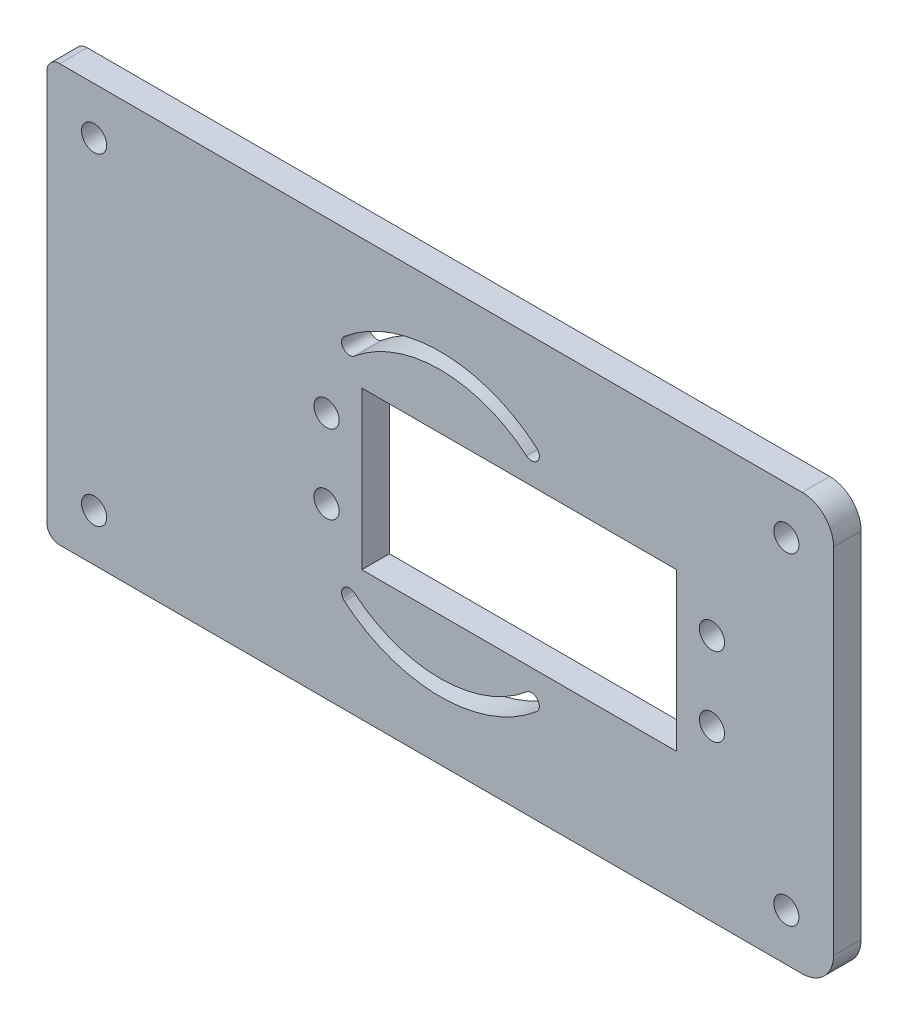
ISO-10303-21;
HEADER;
FILE_DESCRIPTION(('STEP AP214'),'2;1');
FILE_NAME('part.step','',(''),(''),'','','');
FILE_SCHEMA(('AUTOMOTIVE_DESIGN { 1 0 10303 214 1 1 1 1 }'));
ENDSEC;
DATA;
#1=APPLICATION_CONTEXT('core data for automotive mechanical design processes');
#2=APPLICATION_PROTOCOL_DEFINITION('international standard','automotive_design',2000,#1);
#3=PRODUCT_CONTEXT('',#1,'mechanical');
#4=PRODUCT('Part','Part','',(#3));
#5=PRODUCT_RELATED_PRODUCT_CATEGORY('part','',(#4));
#6=PRODUCT_DEFINITION_FORMATION('','',#4);
#7=PRODUCT_DEFINITION_CONTEXT('part definition',#1,'design');
#8=PRODUCT_DEFINITION('design','',#6,#7);
#9=PRODUCT_DEFINITION_SHAPE('','',#8);
#10=(LENGTH_UNIT() NAMED_UNIT(*) SI_UNIT(.MILLI.,.METRE.));
#11=(NAMED_UNIT(*) PLANE_ANGLE_UNIT() SI_UNIT($,.RADIAN.));
#12=(NAMED_UNIT(*) SI_UNIT($,.STERADIAN.) SOLID_ANGLE_UNIT());
#13=UNCERTAINTY_MEASURE_WITH_UNIT(LENGTH_MEASURE(1.E-05),#10,'distance_accuracy_value','');
#14=(GEOMETRIC_REPRESENTATION_CONTEXT(3) GLOBAL_UNCERTAINTY_ASSIGNED_CONTEXT((#13)) GLOBAL_UNIT_ASSIGNED_CONTEXT((#10,
#11,#12)) REPRESENTATION_CONTEXT('',''));
#15=CARTESIAN_POINT('',(0.,0.,0.));
#16=DIRECTION('',(0.,0.,1.));
#17=DIRECTION('',(1.,0.,0.));
#18=AXIS2_PLACEMENT_3D('',#15,#16,#17);
#19=CARTESIAN_POINT('',(-0.0442005485762831,0.,3.5));
#20=DIRECTION('',(0.,0.,-1.));
#21=DIRECTION('',(-1.,0.,0.));
#22=AXIS2_PLACEMENT_3D('',#19,#20,#21);
#23=CYLINDRICAL_SURFACE('',#22,19.);
#24=CARTESIAN_POINT('',(-0.0442005485762831,0.,0.));
#25=DIRECTION('',(0.,0.,1.));
#26=DIRECTION('',(1.,0.,0.));
#27=AXIS2_PLACEMENT_3D('',#24,#25,#26);
#28=CIRCLE('',#27,19.);
#29=CARTESIAN_POINT('',(-12.2297645811815,14.5777923296801,0.));
#30=VERTEX_POINT('',#29);
#31=CARTESIAN_POINT('',(12.1961213713889,14.5318450065922,0.));
#32=VERTEX_POINT('',#31);
#33=EDGE_CURVE('E274',#30,#32,#28,.F.);
#34=ORIENTED_EDGE('',*,*,#33,.T.);
#35=DIRECTION('',(0.,0.,-1.));
#36=VECTOR('',#35,1.);
#37=CARTESIAN_POINT('',(12.1961213713889,14.5318450065922,3.5));
#38=LINE('',#37,#36);
#39=CARTESIAN_POINT('',(12.1961213713889,14.5318450065922,3.5));
#40=VERTEX_POINT('',#39);
#41=EDGE_CURVE('E11',#40,#32,#38,.T.);
#42=ORIENTED_EDGE('',*,*,#41,.F.);
#43=CARTESIAN_POINT('',(-0.0442005485762831,0.,3.5));
#44=DIRECTION('',(0.,0.,1.));
#45=DIRECTION('',(1.,0.,0.));
#46=AXIS2_PLACEMENT_3D('',#43,#44,#45);
#47=CIRCLE('',#46,19.);
#48=CARTESIAN_POINT('',(-12.2297645811815,14.5777923296801,3.5));
#49=VERTEX_POINT('',#48);
#50=EDGE_CURVE('E185',#49,#40,#47,.F.);
#51=ORIENTED_EDGE('',*,*,#50,.F.);
#52=DIRECTION('',(0.,0.,-1.));
#53=VECTOR('',#52,1.);
#54=CARTESIAN_POINT('',(-12.2297645811815,14.5777923296801,3.5));
#55=LINE('',#54,#53);
#56=EDGE_CURVE('E288',#49,#30,#55,.T.);
#57=ORIENTED_EDGE('',*,*,#56,.T.);
#58=EDGE_LOOP('',(#34,#42,#51,#57));
#59=FACE_BOUND('',#58,.T.);
#60=ADVANCED_FACE('F35',(#59),#23,.F.);
#61=CARTESIAN_POINT('',(11.5518939019171,13.7670110588768,3.5));
#62=DIRECTION('',(0.,0.,-1.));
#63=DIRECTION('',(-1.,0.,0.));
#64=AXIS2_PLACEMENT_3D('',#61,#62,#63);
#65=CYLINDRICAL_SURFACE('',#64,1.00000000000001);
#66=CARTESIAN_POINT('',(11.5518939019171,13.7670110588768,0.));
#67=DIRECTION('',(0.,0.,1.));
#68=DIRECTION('',(1.,0.,0.));
#69=AXIS2_PLACEMENT_3D('',#66,#67,#68);
#70=CIRCLE('',#69,1.00000000000001);
#71=CARTESIAN_POINT('',(10.9076664324452,13.0021771111615,0.));
#72=VERTEX_POINT('',#71);
#73=EDGE_CURVE('E191',#32,#72,#70,.F.);
#74=ORIENTED_EDGE('',*,*,#73,.T.);
#75=DIRECTION('',(0.,0.,-1.));
#76=VECTOR('',#75,1.);
#77=CARTESIAN_POINT('',(10.9076664324452,13.0021771111615,3.5));
#78=LINE('',#77,#76);
#79=CARTESIAN_POINT('',(10.9076664324452,13.0021771111615,3.5));
#80=VERTEX_POINT('',#79);
#81=EDGE_CURVE('E45',#80,#72,#78,.T.);
#82=ORIENTED_EDGE('',*,*,#81,.F.);
#83=CARTESIAN_POINT('',(11.5518939019171,13.7670110588768,3.5));
#84=DIRECTION('',(0.,0.,1.));
#85=DIRECTION('',(1.,0.,0.));
#86=AXIS2_PLACEMENT_3D('',#83,#84,#85);
#87=CIRCLE('',#86,1.00000000000001);
#88=EDGE_CURVE('E178',#40,#80,#87,.F.);
#89=ORIENTED_EDGE('',*,*,#88,.F.);
#90=ORIENTED_EDGE('',*,*,#41,.T.);
#91=EDGE_LOOP('',(#74,#82,#89,#90));
#92=FACE_BOUND('',#91,.T.);
#93=ADVANCED_FACE('F190',(#92),#65,.F.);
#94=CARTESIAN_POINT('',(-0.0442005485762831,0.,3.5));
#95=DIRECTION('',(0.,0.,-1.));
#96=DIRECTION('',(-1.,0.,0.));
#97=AXIS2_PLACEMENT_3D('',#94,#95,#96);
#98=CYLINDRICAL_SURFACE('',#97,17.);
#99=CARTESIAN_POINT('',(-0.0442005485762831,0.,0.));
#100=DIRECTION('',(0.,0.,1.));
#101=DIRECTION('',(1.,0.,0.));
#102=AXIS2_PLACEMENT_3D('',#99,#100,#101);
#103=CIRCLE('',#102,17.);
#104=CARTESIAN_POINT('',(-10.9470736303809,13.0432878739243,0.));
#105=VERTEX_POINT('',#104);
#106=EDGE_CURVE('E278',#105,#72,#103,.F.);
#107=ORIENTED_EDGE('',*,*,#106,.F.);
#108=DIRECTION('',(0.,0.,-1.));
#109=VECTOR('',#108,1.);
#110=CARTESIAN_POINT('',(-10.9470736303809,13.0432878739243,3.5));
#111=LINE('',#110,#109);
#112=CARTESIAN_POINT('',(-10.9470736303809,13.0432878739243,3.5));
#113=VERTEX_POINT('',#112);
#114=EDGE_CURVE('E118',#113,#105,#111,.T.);
#115=ORIENTED_EDGE('',*,*,#114,.F.);
#116=CARTESIAN_POINT('',(-0.0442005485762831,0.,3.5));
#117=DIRECTION('',(0.,0.,1.));
#118=DIRECTION('',(1.,0.,0.));
#119=AXIS2_PLACEMENT_3D('',#116,#117,#118);
#120=CIRCLE('',#119,17.);
#121=EDGE_CURVE('E183',#113,#80,#120,.F.);
#122=ORIENTED_EDGE('',*,*,#121,.T.);
#123=ORIENTED_EDGE('',*,*,#81,.T.);
#124=EDGE_LOOP('',(#107,#115,#122,#123));
#125=FACE_BOUND('',#124,.T.);
#126=ADVANCED_FACE('F196',(#125),#98,.T.);
#127=CARTESIAN_POINT('',(0.,10.,3.5));
#128=DIRECTION('',(0.,1.,0.));
#129=DIRECTION('',(-1.,0.,0.));
#130=AXIS2_PLACEMENT_3D('',#127,#128,#129);
#131=PLANE('',#130);
#132=DIRECTION('',(1.,0.,0.));
#133=VECTOR('',#132,1.);
#134=CARTESIAN_POINT('',(0.,10.,0.));
#135=LINE('',#134,#133);
#136=CARTESIAN_POINT('',(-10.,10.,0.));
#137=VERTEX_POINT('',#136);
#138=CARTESIAN_POINT('',(30.,10.,0.));
#139=VERTEX_POINT('',#138);
#140=EDGE_CURVE('E262',#137,#139,#135,.T.);
#141=ORIENTED_EDGE('',*,*,#140,.T.);
#142=DIRECTION('',(0.,0.,-1.));
#143=VECTOR('',#142,1.);
#144=CARTESIAN_POINT('',(30.,10.,3.5));
#145=LINE('',#144,#143);
#146=CARTESIAN_POINT('',(30.,10.,3.5));
#147=VERTEX_POINT('',#146);
#148=EDGE_CURVE('E290',#147,#139,#145,.T.);
#149=ORIENTED_EDGE('',*,*,#148,.F.);
#150=DIRECTION('',(1.,0.,0.));
#151=VECTOR('',#150,1.);
#152=CARTESIAN_POINT('',(0.,10.,3.5));
#153=LINE('',#152,#151);
#154=CARTESIAN_POINT('',(-10.,10.,3.5));
#155=VERTEX_POINT('',#154);
#156=EDGE_CURVE('E384',#155,#147,#153,.T.);
#157=ORIENTED_EDGE('',*,*,#156,.F.);
#158=DIRECTION('',(0.,0.,-1.));
#159=VECTOR('',#158,1.);
#160=CARTESIAN_POINT('',(-10.,10.,3.5));
#161=LINE('',#160,#159);
#162=EDGE_CURVE('E292',#155,#137,#161,.T.);
#163=ORIENTED_EDGE('',*,*,#162,.T.);
#164=EDGE_LOOP('',(#141,#149,#157,#163));
#165=FACE_BOUND('',#164,.T.);
#166=ADVANCED_FACE('F410',(#165),#131,.F.);
#167=CARTESIAN_POINT('',(30.,0.,3.5));
#168=DIRECTION('',(1.,0.,0.));
#169=DIRECTION('',(0.,0.,-1.));
#170=AXIS2_PLACEMENT_3D('',#167,#168,#169);
#171=PLANE('',#170);
#172=DIRECTION('',(0.,-1.,0.));
#173=VECTOR('',#172,1.);
#174=CARTESIAN_POINT('',(30.,0.,0.));
#175=LINE('',#174,#173);
#176=CARTESIAN_POINT('',(30.,-10.,0.));
#177=VERTEX_POINT('',#176);
#178=EDGE_CURVE('E265',#139,#177,#175,.T.);
#179=ORIENTED_EDGE('',*,*,#178,.T.);
#180=DIRECTION('',(0.,0.,-1.));
#181=VECTOR('',#180,1.);
#182=CARTESIAN_POINT('',(30.,-10.,3.5));
#183=LINE('',#182,#181);
#184=CARTESIAN_POINT('',(30.,-10.,3.5));
#185=VERTEX_POINT('',#184);
#186=EDGE_CURVE('E297',#185,#177,#183,.T.);
#187=ORIENTED_EDGE('',*,*,#186,.F.);
#188=DIRECTION('',(0.,-1.,0.));
#189=VECTOR('',#188,1.);
#190=CARTESIAN_POINT('',(30.,0.,3.5));
#191=LINE('',#190,#189);
#192=EDGE_CURVE('E387',#147,#185,#191,.T.);
#193=ORIENTED_EDGE('',*,*,#192,.F.);
#194=ORIENTED_EDGE('',*,*,#148,.T.);
#195=EDGE_LOOP('',(#179,#187,#193,#194));
#196=FACE_BOUND('',#195,.T.);
#197=ADVANCED_FACE('F412',(#196),#171,.F.);
#198=CARTESIAN_POINT('',(0.,-10.,3.5));
#199=DIRECTION('',(0.,1.,0.));
#200=DIRECTION('',(-1.,0.,0.));
#201=AXIS2_PLACEMENT_3D('',#198,#199,#200);
#202=PLANE('',#201);
#203=DIRECTION('',(1.,0.,0.));
#204=VECTOR('',#203,1.);
#205=CARTESIAN_POINT('',(0.,-10.,0.));
#206=LINE('',#205,#204);
#207=CARTESIAN_POINT('',(-10.,-10.,0.));
#208=VERTEX_POINT('',#207);
#209=EDGE_CURVE('E268',#208,#177,#206,.T.);
#210=ORIENTED_EDGE('',*,*,#209,.F.);
#211=DIRECTION('',(0.,0.,-1.));
#212=VECTOR('',#211,1.);
#213=CARTESIAN_POINT('',(-10.,-10.,3.5));
#214=LINE('',#213,#212);
#215=CARTESIAN_POINT('',(-10.,-10.,3.5));
#216=VERTEX_POINT('',#215);
#217=EDGE_CURVE('E294',#216,#208,#214,.T.);
#218=ORIENTED_EDGE('',*,*,#217,.F.);
#219=DIRECTION('',(1.,0.,0.));
#220=VECTOR('',#219,1.);
#221=CARTESIAN_POINT('',(0.,-10.,3.5));
#222=LINE('',#221,#220);
#223=EDGE_CURVE('E389',#216,#185,#222,.T.);
#224=ORIENTED_EDGE('',*,*,#223,.T.);
#225=ORIENTED_EDGE('',*,*,#186,.T.);
#226=EDGE_LOOP('',(#210,#218,#224,#225));
#227=FACE_BOUND('',#226,.T.);
#228=ADVANCED_FACE('F405',(#227),#202,.T.);
#229=CARTESIAN_POINT('',(11.5518939019171,-13.7670110588768,3.5));
#230=DIRECTION('',(0.,0.,-1.));
#231=DIRECTION('',(-1.,0.,0.));
#232=AXIS2_PLACEMENT_3D('',#229,#230,#231);
#233=CYLINDRICAL_SURFACE('',#232,1.);
#234=CARTESIAN_POINT('',(11.5518939019171,-13.7670110588768,0.));
#235=DIRECTION('',(0.,0.,1.));
#236=DIRECTION('',(1.,0.,0.));
#237=AXIS2_PLACEMENT_3D('',#234,#235,#236);
#238=CIRCLE('',#237,1.);
#239=CARTESIAN_POINT('',(12.1961213713889,-14.5318450065922,0.));
#240=VERTEX_POINT('',#239);
#241=CARTESIAN_POINT('',(10.9076664324452,-13.0021771111615,0.));
#242=VERTEX_POINT('',#241);
#243=EDGE_CURVE('E238',#240,#242,#238,.T.);
#244=ORIENTED_EDGE('',*,*,#243,.F.);
#245=DIRECTION('',(0.,0.,-1.));
#246=VECTOR('',#245,1.);
#247=CARTESIAN_POINT('',(12.1961213713889,-14.5318450065922,3.5));
#248=LINE('',#247,#246);
#249=CARTESIAN_POINT('',(12.1961213713889,-14.5318450065922,3.5));
#250=VERTEX_POINT('',#249);
#251=EDGE_CURVE('E295',#250,#240,#248,.T.);
#252=ORIENTED_EDGE('',*,*,#251,.F.);
#253=CARTESIAN_POINT('',(11.5518939019171,-13.7670110588768,3.5));
#254=DIRECTION('',(0.,0.,1.));
#255=DIRECTION('',(1.,0.,0.));
#256=AXIS2_PLACEMENT_3D('',#253,#254,#255);
#257=CIRCLE('',#256,1.);
#258=CARTESIAN_POINT('',(10.9076664324452,-13.0021771111615,3.5));
#259=VERTEX_POINT('',#258);
#260=EDGE_CURVE('E361',#250,#259,#257,.T.);
#261=ORIENTED_EDGE('',*,*,#260,.T.);
#262=DIRECTION('',(0.,0.,-1.));
#263=VECTOR('',#262,1.);
#264=CARTESIAN_POINT('',(10.9076664324452,-13.0021771111615,3.5));
#265=LINE('',#264,#263);
#266=EDGE_CURVE('E301',#259,#242,#265,.T.);
#267=ORIENTED_EDGE('',*,*,#266,.T.);
#268=EDGE_LOOP('',(#244,#252,#261,#267));
#269=FACE_BOUND('',#268,.T.);
#270=ADVANCED_FACE('F419',(#269),#233,.F.);
#271=CARTESIAN_POINT('',(-0.0442005485762831,0.,3.5));
#272=DIRECTION('',(0.,0.,-1.));
#273=DIRECTION('',(-1.,0.,0.));
#274=AXIS2_PLACEMENT_3D('',#271,#272,#273);
#275=CYLINDRICAL_SURFACE('',#274,19.);
#276=CARTESIAN_POINT('',(-0.0442005485762831,0.,0.));
#277=DIRECTION('',(0.,0.,1.));
#278=DIRECTION('',(1.,0.,0.));
#279=AXIS2_PLACEMENT_3D('',#276,#277,#278);
#280=CIRCLE('',#279,19.);
#281=CARTESIAN_POINT('',(-12.2297645811815,-14.5777923296801,0.));
#282=VERTEX_POINT('',#281);
#283=EDGE_CURVE('E241',#282,#240,#280,.T.);
#284=ORIENTED_EDGE('',*,*,#283,.F.);
#285=DIRECTION('',(0.,0.,-1.));
#286=VECTOR('',#285,1.);
#287=CARTESIAN_POINT('',(-12.2297645811815,-14.5777923296801,3.5));
#288=LINE('',#287,#286);
#289=CARTESIAN_POINT('',(-12.2297645811815,-14.5777923296801,3.5));
#290=VERTEX_POINT('',#289);
#291=EDGE_CURVE('E305',#290,#282,#288,.T.);
#292=ORIENTED_EDGE('',*,*,#291,.F.);
#293=CARTESIAN_POINT('',(-0.0442005485762831,0.,3.5));
#294=DIRECTION('',(0.,0.,1.));
#295=DIRECTION('',(1.,0.,0.));
#296=AXIS2_PLACEMENT_3D('',#293,#294,#295);
#297=CIRCLE('',#296,19.);
#298=EDGE_CURVE('E364',#290,#250,#297,.T.);
#299=ORIENTED_EDGE('',*,*,#298,.T.);
#300=ORIENTED_EDGE('',*,*,#251,.T.);
#301=EDGE_LOOP('',(#284,#292,#299,#300));
#302=FACE_BOUND('',#301,.T.);
#303=ADVANCED_FACE('F478',(#302),#275,.F.);
#304=CARTESIAN_POINT('',(-11.5884191057812,-13.8105401018022,3.5));
#305=DIRECTION('',(0.,0.,-1.));
#306=DIRECTION('',(-1.,0.,0.));
#307=AXIS2_PLACEMENT_3D('',#304,#305,#306);
#308=CYLINDRICAL_SURFACE('',#307,1.);
#309=CARTESIAN_POINT('',(-11.5884191057812,-13.8105401018022,0.));
#310=DIRECTION('',(0.,0.,1.));
#311=DIRECTION('',(1.,0.,0.));
#312=AXIS2_PLACEMENT_3D('',#309,#310,#311);
#313=CIRCLE('',#312,1.);
#314=CARTESIAN_POINT('',(-10.9470736303809,-13.0432878739243,0.));
#315=VERTEX_POINT('',#314);
#316=EDGE_CURVE('E244',#315,#282,#313,.T.);
#317=ORIENTED_EDGE('',*,*,#316,.F.);
#318=DIRECTION('',(0.,0.,-1.));
#319=VECTOR('',#318,1.);
#320=CARTESIAN_POINT('',(-10.9470736303809,-13.0432878739243,3.5));
#321=LINE('',#320,#319);
#322=CARTESIAN_POINT('',(-10.9470736303809,-13.0432878739243,3.5));
#323=VERTEX_POINT('',#322);
#324=EDGE_CURVE('E303',#323,#315,#321,.T.);
#325=ORIENTED_EDGE('',*,*,#324,.F.);
#326=CARTESIAN_POINT('',(-11.5884191057812,-13.8105401018022,3.5));
#327=DIRECTION('',(0.,0.,1.));
#328=DIRECTION('',(1.,0.,0.));
#329=AXIS2_PLACEMENT_3D('',#326,#327,#328);
#330=CIRCLE('',#329,1.);
#331=EDGE_CURVE('E367',#323,#290,#330,.T.);
#332=ORIENTED_EDGE('',*,*,#331,.T.);
#333=ORIENTED_EDGE('',*,*,#291,.T.);
#334=EDGE_LOOP('',(#317,#325,#332,#333));
#335=FACE_BOUND('',#334,.T.);
#336=ADVANCED_FACE('F488',(#335),#308,.F.);
#337=CARTESIAN_POINT('',(45.9557994514237,-22.5,3.5));
#338=DIRECTION('',(0.,0.,-1.));
#339=DIRECTION('',(-1.,0.,0.));
#340=AXIS2_PLACEMENT_3D('',#337,#338,#339);
#341=CYLINDRICAL_SURFACE('',#340,4.);
#342=CARTESIAN_POINT('',(45.9557994514237,-22.5,0.));
#343=DIRECTION('',(0.,0.,1.));
#344=DIRECTION('',(1.,0.,0.));
#345=AXIS2_PLACEMENT_3D('',#342,#343,#344);
#346=CIRCLE('',#345,4.);
#347=CARTESIAN_POINT('',(49.9557994514237,-22.5,0.));
#348=VERTEX_POINT('',#347);
#349=CARTESIAN_POINT('',(45.9557994514237,-26.5,0.));
#350=VERTEX_POINT('',#349);
#351=EDGE_CURVE('E214',#348,#350,#346,.F.);
#352=ORIENTED_EDGE('',*,*,#351,.F.);
#353=DIRECTION('',(0.,0.,-1.));
#354=VECTOR('',#353,1.);
#355=CARTESIAN_POINT('',(49.9557994514237,-22.5,3.5));
#356=LINE('',#355,#354);
#357=CARTESIAN_POINT('',(49.9557994514237,-22.5,3.5));
#358=VERTEX_POINT('',#357);
#359=EDGE_CURVE('E39',#358,#348,#356,.T.);
#360=ORIENTED_EDGE('',*,*,#359,.F.);
#361=CARTESIAN_POINT('',(45.9557994514237,-22.5,3.5));
#362=DIRECTION('',(0.,0.,1.));
#363=DIRECTION('',(1.,0.,0.));
#364=AXIS2_PLACEMENT_3D('',#361,#362,#363);
#365=CIRCLE('',#364,4.);
#366=CARTESIAN_POINT('',(45.9557994514237,-26.5,3.5));
#367=VERTEX_POINT('',#366);
#368=EDGE_CURVE('E687',#358,#367,#365,.F.);
#369=ORIENTED_EDGE('',*,*,#368,.T.);
#370=DIRECTION('',(0.,0.,-1.));
#371=VECTOR('',#370,1.);
#372=CARTESIAN_POINT('',(45.9557994514237,-26.5,3.5));
#373=LINE('',#372,#371);
#374=EDGE_CURVE('E207',#367,#350,#373,.T.);
#375=ORIENTED_EDGE('',*,*,#374,.T.);
#376=EDGE_LOOP('',(#352,#360,#369,#375));
#377=FACE_BOUND('',#376,.T.);
#378=ADVANCED_FACE('F328',(#377),#341,.T.);
#379=CARTESIAN_POINT('',(49.9557994514237,0.,3.5));
#380=DIRECTION('',(1.,0.,0.));
#381=DIRECTION('',(0.,1.,0.));
#382=AXIS2_PLACEMENT_3D('',#379,#380,#381);
#383=PLANE('',#382);
#384=DIRECTION('',(0.,-1.,0.));
#385=VECTOR('',#384,1.);
#386=CARTESIAN_POINT('',(49.9557994514237,0.,0.));
#387=LINE('',#386,#385);
#388=CARTESIAN_POINT('',(49.9557994514237,22.5,0.));
#389=VERTEX_POINT('',#388);
#390=EDGE_CURVE('E217',#389,#348,#387,.T.);
#391=ORIENTED_EDGE('',*,*,#390,.F.);
#392=DIRECTION('',(0.,0.,-1.));
#393=VECTOR('',#392,1.);
#394=CARTESIAN_POINT('',(49.9557994514237,22.5,3.5));
#395=LINE('',#394,#393);
#396=CARTESIAN_POINT('',(49.9557994514237,22.5,3.5));
#397=VERTEX_POINT('',#396);
#398=EDGE_CURVE('E318',#397,#389,#395,.T.);
#399=ORIENTED_EDGE('',*,*,#398,.F.);
#400=DIRECTION('',(0.,-1.,0.));
#401=VECTOR('',#400,1.);
#402=CARTESIAN_POINT('',(49.9557994514237,0.,3.5));
#403=LINE('',#402,#401);
#404=EDGE_CURVE('E327',#397,#358,#403,.T.);
#405=ORIENTED_EDGE('',*,*,#404,.T.);
#406=ORIENTED_EDGE('',*,*,#359,.T.);
#407=EDGE_LOOP('',(#391,#399,#405,#406));
#408=FACE_BOUND('',#407,.T.);
#409=ADVANCED_FACE('F325',(#408),#383,.T.);
#410=CARTESIAN_POINT('',(45.9557994514237,22.5,3.5));
#411=DIRECTION('',(0.,0.,-1.));
#412=DIRECTION('',(-1.,0.,0.));
#413=AXIS2_PLACEMENT_3D('',#410,#411,#412);
#414=CYLINDRICAL_SURFACE('',#413,4.);
#415=CARTESIAN_POINT('',(45.9557994514237,22.5,0.));
#416=DIRECTION('',(0.,0.,1.));
#417=DIRECTION('',(1.,0.,0.));
#418=AXIS2_PLACEMENT_3D('',#415,#416,#417);
#419=CIRCLE('',#418,4.);
#420=CARTESIAN_POINT('',(45.9557994514237,26.5,0.));
#421=VERTEX_POINT('',#420);
#422=EDGE_CURVE('E220',#421,#389,#419,.F.);
#423=ORIENTED_EDGE('',*,*,#422,.F.);
#424=DIRECTION('',(0.,0.,-1.));
#425=VECTOR('',#424,1.);
#426=CARTESIAN_POINT('',(45.9557994514237,26.5,3.5));
#427=LINE('',#426,#425);
#428=CARTESIAN_POINT('',(45.9557994514237,26.5,3.5));
#429=VERTEX_POINT('',#428);
#430=EDGE_CURVE('E317',#429,#421,#427,.T.);
#431=ORIENTED_EDGE('',*,*,#430,.F.);
#432=CARTESIAN_POINT('',(45.9557994514237,22.5,3.5));
#433=DIRECTION('',(0.,0.,1.));
#434=DIRECTION('',(1.,0.,0.));
#435=AXIS2_PLACEMENT_3D('',#432,#433,#434);
#436=CIRCLE('',#435,4.);
#437=EDGE_CURVE('E338',#429,#397,#436,.F.);
#438=ORIENTED_EDGE('',*,*,#437,.T.);
#439=ORIENTED_EDGE('',*,*,#398,.T.);
#440=EDGE_LOOP('',(#423,#431,#438,#439));
#441=FACE_BOUND('',#440,.T.);
#442=ADVANCED_FACE('F336',(#441),#414,.T.);
#443=CARTESIAN_POINT('',(0.,26.5,3.5));
#444=DIRECTION('',(0.,1.,0.));
#445=DIRECTION('',(0.,0.,1.));
#446=AXIS2_PLACEMENT_3D('',#443,#444,#445);
#447=PLANE('',#446);
#448=DIRECTION('',(1.,0.,0.));
#449=VECTOR('',#448,1.);
#450=CARTESIAN_POINT('',(0.,26.5,0.));
#451=LINE('',#450,#449);
#452=CARTESIAN_POINT('',(-48.4290015311776,26.5,0.));
#453=VERTEX_POINT('',#452);
#454=EDGE_CURVE('E223',#453,#421,#451,.T.);
#455=ORIENTED_EDGE('',*,*,#454,.F.);
#456=DIRECTION('',(0.,0.,-1.));
#457=VECTOR('',#456,1.);
#458=CARTESIAN_POINT('',(-48.4290015311776,26.5,3.5));
#459=LINE('',#458,#457);
#460=CARTESIAN_POINT('',(-48.4290015311776,26.5,3.5));
#461=VERTEX_POINT('',#460);
#462=EDGE_CURVE('E315',#461,#453,#459,.T.);
#463=ORIENTED_EDGE('',*,*,#462,.F.);
#464=DIRECTION('',(1.,0.,0.));
#465=VECTOR('',#464,1.);
#466=CARTESIAN_POINT('',(0.,26.5,3.5));
#467=LINE('',#466,#465);
#468=EDGE_CURVE('E344',#461,#429,#467,.T.);
#469=ORIENTED_EDGE('',*,*,#468,.T.);
#470=ORIENTED_EDGE('',*,*,#430,.T.);
#471=EDGE_LOOP('',(#455,#463,#469,#470));
#472=FACE_BOUND('',#471,.T.);
#473=ADVANCED_FACE('F346',(#472),#447,.T.);
#474=CARTESIAN_POINT('',(-48.4290015311776,24.8848009826013,3.5));
#475=DIRECTION('',(0.,0.,-1.));
#476=DIRECTION('',(-1.,0.,0.));
#477=AXIS2_PLACEMENT_3D('',#474,#475,#476);
#478=CYLINDRICAL_SURFACE('',#477,1.61519901739871);
#479=CARTESIAN_POINT('',(-48.4290015311776,24.8848009826013,0.));
#480=DIRECTION('',(0.,0.,1.));
#481=DIRECTION('',(1.,0.,0.));
#482=AXIS2_PLACEMENT_3D('',#479,#480,#481);
#483=CIRCLE('',#482,1.61519901739871);
#484=CARTESIAN_POINT('',(-50.0442005485763,24.8848009826013,0.));
#485=VERTEX_POINT('',#484);
#486=EDGE_CURVE('E226',#453,#485,#483,.T.);
#487=ORIENTED_EDGE('',*,*,#486,.T.);
#488=DIRECTION('',(0.,0.,-1.));
#489=VECTOR('',#488,1.);
#490=CARTESIAN_POINT('',(-50.0442005485763,24.8848009826013,3.5));
#491=LINE('',#490,#489);
#492=CARTESIAN_POINT('',(-50.0442005485763,24.8848009826013,3.5));
#493=VERTEX_POINT('',#492);
#494=EDGE_CURVE('E313',#493,#485,#491,.T.);
#495=ORIENTED_EDGE('',*,*,#494,.F.);
#496=CARTESIAN_POINT('',(-48.4290015311776,24.8848009826013,3.5));
#497=DIRECTION('',(0.,0.,1.));
#498=DIRECTION('',(1.,0.,0.));
#499=AXIS2_PLACEMENT_3D('',#496,#497,#498);
#500=CIRCLE('',#499,1.61519901739871);
#501=EDGE_CURVE('E348',#461,#493,#500,.T.);
#502=ORIENTED_EDGE('',*,*,#501,.F.);
#503=ORIENTED_EDGE('',*,*,#462,.T.);
#504=EDGE_LOOP('',(#487,#495,#502,#503));
#505=FACE_BOUND('',#504,.T.);
#506=ADVANCED_FACE('F531',(#505),#478,.T.);
#507=CARTESIAN_POINT('',(-50.0442005485763,0.,3.5));
#508=DIRECTION('',(-1.,0.,0.));
#509=DIRECTION('',(0.,-1.,0.));
#510=AXIS2_PLACEMENT_3D('',#507,#508,#509);
#511=PLANE('',#510);
#512=DIRECTION('',(0.,1.,0.));
#513=VECTOR('',#512,1.);
#514=CARTESIAN_POINT('',(-50.0442005485763,0.,0.));
#515=LINE('',#514,#513);
#516=CARTESIAN_POINT('',(-50.0442005485763,-24.8848009826013,0.));
#517=VERTEX_POINT('',#516);
#518=EDGE_CURVE('E229',#517,#485,#515,.T.);
#519=ORIENTED_EDGE('',*,*,#518,.F.);
#520=DIRECTION('',(0.,0.,-1.));
#521=VECTOR('',#520,1.);
#522=CARTESIAN_POINT('',(-50.0442005485763,-24.8848009826013,3.5));
#523=LINE('',#522,#521);
#524=CARTESIAN_POINT('',(-50.0442005485763,-24.8848009826013,3.5));
#525=VERTEX_POINT('',#524);
#526=EDGE_CURVE('E311',#525,#517,#523,.T.);
#527=ORIENTED_EDGE('',*,*,#526,.F.);
#528=DIRECTION('',(0.,1.,0.));
#529=VECTOR('',#528,1.);
#530=CARTESIAN_POINT('',(-50.0442005485763,0.,3.5));
#531=LINE('',#530,#529);
#532=EDGE_CURVE('E350',#525,#493,#531,.T.);
#533=ORIENTED_EDGE('',*,*,#532,.T.);
#534=ORIENTED_EDGE('',*,*,#494,.T.);
#535=EDGE_LOOP('',(#519,#527,#533,#534));
#536=FACE_BOUND('',#535,.T.);
#537=ADVANCED_FACE('F540',(#536),#511,.T.);
#538=CARTESIAN_POINT('',(-48.4290015311776,-24.8848009826013,3.5));
#539=DIRECTION('',(0.,0.,-1.));
#540=DIRECTION('',(-1.,0.,0.));
#541=AXIS2_PLACEMENT_3D('',#538,#539,#540);
#542=CYLINDRICAL_SURFACE('',#541,1.61519901739871);
#543=CARTESIAN_POINT('',(-48.4290015311776,-24.8848009826013,0.));
#544=DIRECTION('',(0.,0.,1.));
#545=DIRECTION('',(1.,0.,0.));
#546=AXIS2_PLACEMENT_3D('',#543,#544,#545);
#547=CIRCLE('',#546,1.61519901739871);
#548=CARTESIAN_POINT('',(-48.4290015311776,-26.5,0.));
#549=VERTEX_POINT('',#548);
#550=EDGE_CURVE('E232',#549,#517,#547,.F.);
#551=ORIENTED_EDGE('',*,*,#550,.F.);
#552=DIRECTION('',(0.,0.,-1.));
#553=VECTOR('',#552,1.);
#554=CARTESIAN_POINT('',(-48.4290015311776,-26.5,3.5));
#555=LINE('',#554,#553);
#556=CARTESIAN_POINT('',(-48.4290015311776,-26.5,3.5));
#557=VERTEX_POINT('',#556);
#558=EDGE_CURVE('E309',#557,#549,#555,.T.);
#559=ORIENTED_EDGE('',*,*,#558,.F.);
#560=CARTESIAN_POINT('',(-48.4290015311776,-24.8848009826013,3.5));
#561=DIRECTION('',(0.,0.,1.));
#562=DIRECTION('',(1.,0.,0.));
#563=AXIS2_PLACEMENT_3D('',#560,#561,#562);
#564=CIRCLE('',#563,1.61519901739871);
#565=EDGE_CURVE('E356',#557,#525,#564,.F.);
#566=ORIENTED_EDGE('',*,*,#565,.T.);
#567=ORIENTED_EDGE('',*,*,#526,.T.);
#568=EDGE_LOOP('',(#551,#559,#566,#567));
#569=FACE_BOUND('',#568,.T.);
#570=ADVANCED_FACE('F446',(#569),#542,.T.);
#571=CARTESIAN_POINT('',(34.5,-5.,3.5));
#572=DIRECTION('',(0.,0.,-1.));
#573=DIRECTION('',(-1.,0.,0.));
#574=AXIS2_PLACEMENT_3D('',#571,#572,#573);
#575=CYLINDRICAL_SURFACE('',#574,1.6);
#576=CARTESIAN_POINT('',(34.5,-5.,3.5));
#577=DIRECTION('',(0.,0.,1.));
#578=DIRECTION('',(1.,0.,0.));
#579=AXIS2_PLACEMENT_3D('',#576,#577,#578);
#580=CIRCLE('',#579,1.6);
#581=CARTESIAN_POINT('',(36.1,-5.,3.5));
#582=VERTEX_POINT('',#581);
#583=EDGE_CURVE('E198',#582,#582,#580,.T.);
#584=ORIENTED_EDGE('',*,*,#583,.T.);
#585=EDGE_LOOP('',(#584));
#586=FACE_BOUND('',#585,.T.);
#587=CARTESIAN_POINT('',(34.5,-5.,0.));
#588=DIRECTION('',(0.,0.,1.));
#589=DIRECTION('',(1.,0.,0.));
#590=AXIS2_PLACEMENT_3D('',#587,#588,#589);
#591=CIRCLE('',#590,1.6);
#592=CARTESIAN_POINT('',(36.1,-5.,0.));
#593=VERTEX_POINT('',#592);
#594=EDGE_CURVE('E281',#593,#593,#591,.T.);
#595=ORIENTED_EDGE('',*,*,#594,.F.);
#596=EDGE_LOOP('',(#595));
#597=FACE_BOUND('',#596,.T.);
#598=ADVANCED_FACE('F441',(#586,#597),#575,.F.);
#599=CARTESIAN_POINT('',(-11.5884191057812,13.8105401018022,3.5));
#600=DIRECTION('',(0.,0.,-1.));
#601=DIRECTION('',(-1.,0.,0.));
#602=AXIS2_PLACEMENT_3D('',#599,#600,#601);
#603=CYLINDRICAL_SURFACE('',#602,0.999999999999996);
#604=CARTESIAN_POINT('',(-11.5884191057812,13.8105401018022,0.));
#605=DIRECTION('',(0.,0.,1.));
#606=DIRECTION('',(1.,0.,0.));
#607=AXIS2_PLACEMENT_3D('',#604,#605,#606);
#608=CIRCLE('',#607,0.999999999999996);
#609=EDGE_CURVE('E121',#105,#30,#608,.F.);
#610=ORIENTED_EDGE('',*,*,#609,.T.);
#611=ORIENTED_EDGE('',*,*,#56,.F.);
#612=CARTESIAN_POINT('',(-11.5884191057812,13.8105401018022,3.5));
#613=DIRECTION('',(0.,0.,1.));
#614=DIRECTION('',(1.,0.,0.));
#615=AXIS2_PLACEMENT_3D('',#612,#613,#614);
#616=CIRCLE('',#615,0.999999999999996);
#617=EDGE_CURVE('E54',#113,#49,#616,.F.);
#618=ORIENTED_EDGE('',*,*,#617,.F.);
#619=ORIENTED_EDGE('',*,*,#114,.T.);
#620=EDGE_LOOP('',(#610,#611,#618,#619));
#621=FACE_BOUND('',#620,.T.);
#622=ADVANCED_FACE('F433',(#621),#603,.F.);
#623=CARTESIAN_POINT('',(-10.,0.,3.5));
#624=DIRECTION('',(1.,0.,0.));
#625=DIRECTION('',(0.,0.,-1.));
#626=AXIS2_PLACEMENT_3D('',#623,#624,#625);
#627=PLANE('',#626);
#628=DIRECTION('',(0.,-1.,0.));
#629=VECTOR('',#628,1.);
#630=CARTESIAN_POINT('',(-10.,0.,0.));
#631=LINE('',#630,#629);
#632=EDGE_CURVE('E271',#137,#208,#631,.T.);
#633=ORIENTED_EDGE('',*,*,#632,.F.);
#634=ORIENTED_EDGE('',*,*,#162,.F.);
#635=DIRECTION('',(0.,-1.,0.));
#636=VECTOR('',#635,1.);
#637=CARTESIAN_POINT('',(-10.,0.,3.5));
#638=LINE('',#637,#636);
#639=EDGE_CURVE('E392',#155,#216,#638,.T.);
#640=ORIENTED_EDGE('',*,*,#639,.T.);
#641=ORIENTED_EDGE('',*,*,#217,.T.);
#642=EDGE_LOOP('',(#633,#634,#640,#641));
#643=FACE_BOUND('',#642,.T.);
#644=ADVANCED_FACE('F397',(#643),#627,.T.);
#645=CARTESIAN_POINT('',(43.9557994514237,-20.5,3.5));
#646=DIRECTION('',(0.,0.,-1.));
#647=DIRECTION('',(-1.,0.,0.));
#648=AXIS2_PLACEMENT_3D('',#645,#646,#647);
#649=CYLINDRICAL_SURFACE('',#648,1.6);
#650=CARTESIAN_POINT('',(43.9557994514237,-20.5,3.5));
#651=DIRECTION('',(0.,0.,1.));
#652=DIRECTION('',(1.,0.,0.));
#653=AXIS2_PLACEMENT_3D('',#650,#651,#652);
#654=CIRCLE('',#653,1.6);
#655=CARTESIAN_POINT('',(45.5557994514237,-20.5,3.5));
#656=VERTEX_POINT('',#655);
#657=EDGE_CURVE('E381',#656,#656,#654,.T.);
#658=ORIENTED_EDGE('',*,*,#657,.T.);
#659=EDGE_LOOP('',(#658));
#660=FACE_BOUND('',#659,.T.);
#661=CARTESIAN_POINT('',(43.9557994514237,-20.5,0.));
#662=DIRECTION('',(0.,0.,1.));
#663=DIRECTION('',(1.,0.,0.));
#664=AXIS2_PLACEMENT_3D('',#661,#662,#663);
#665=CIRCLE('',#664,1.6);
#666=CARTESIAN_POINT('',(45.5557994514237,-20.5,0.));
#667=VERTEX_POINT('',#666);
#668=EDGE_CURVE('E259',#667,#667,#665,.T.);
#669=ORIENTED_EDGE('',*,*,#668,.F.);
#670=EDGE_LOOP('',(#669));
#671=FACE_BOUND('',#670,.T.);
#672=ADVANCED_FACE('F432',(#660,#671),#649,.F.);
#673=CARTESIAN_POINT('',(43.9557994514237,20.5,3.5));
#674=DIRECTION('',(0.,0.,-1.));
#675=DIRECTION('',(-1.,0.,0.));
#676=AXIS2_PLACEMENT_3D('',#673,#674,#675);
#677=CYLINDRICAL_SURFACE('',#676,1.6);
#678=CARTESIAN_POINT('',(43.9557994514237,20.5,3.5));
#679=DIRECTION('',(0.,0.,1.));
#680=DIRECTION('',(1.,0.,0.));
#681=AXIS2_PLACEMENT_3D('',#678,#679,#680);
#682=CIRCLE('',#681,1.6);
#683=CARTESIAN_POINT('',(45.5557994514237,20.5,3.5));
#684=VERTEX_POINT('',#683);
#685=EDGE_CURVE('E378',#684,#684,#682,.T.);
#686=ORIENTED_EDGE('',*,*,#685,.T.);
#687=EDGE_LOOP('',(#686));
#688=FACE_BOUND('',#687,.T.);
#689=CARTESIAN_POINT('',(43.9557994514237,20.5,0.));
#690=DIRECTION('',(0.,0.,1.));
#691=DIRECTION('',(1.,0.,0.));
#692=AXIS2_PLACEMENT_3D('',#689,#690,#691);
#693=CIRCLE('',#692,1.6);
#694=CARTESIAN_POINT('',(45.5557994514237,20.5,0.));
#695=VERTEX_POINT('',#694);
#696=EDGE_CURVE('E256',#695,#695,#693,.T.);
#697=ORIENTED_EDGE('',*,*,#696,.F.);
#698=EDGE_LOOP('',(#697));
#699=FACE_BOUND('',#698,.T.);
#700=ADVANCED_FACE('F438',(#688,#699),#677,.F.);
#701=CARTESIAN_POINT('',(-44.0442005485763,20.5,3.5));
#702=DIRECTION('',(0.,0.,-1.));
#703=DIRECTION('',(-1.,0.,0.));
#704=AXIS2_PLACEMENT_3D('',#701,#702,#703);
#705=CYLINDRICAL_SURFACE('',#704,1.6);
#706=CARTESIAN_POINT('',(-44.0442005485763,20.5,3.5));
#707=DIRECTION('',(0.,0.,1.));
#708=DIRECTION('',(1.,0.,0.));
#709=AXIS2_PLACEMENT_3D('',#706,#707,#708);
#710=CIRCLE('',#709,1.6);
#711=CARTESIAN_POINT('',(-42.4442005485763,20.5,3.5));
#712=VERTEX_POINT('',#711);
#713=EDGE_CURVE('E375',#712,#712,#710,.T.);
#714=ORIENTED_EDGE('',*,*,#713,.T.);
#715=EDGE_LOOP('',(#714));
#716=FACE_BOUND('',#715,.T.);
#717=CARTESIAN_POINT('',(-44.0442005485763,20.5,0.));
#718=DIRECTION('',(0.,0.,1.));
#719=DIRECTION('',(1.,0.,0.));
#720=AXIS2_PLACEMENT_3D('',#717,#718,#719);
#721=CIRCLE('',#720,1.6);
#722=CARTESIAN_POINT('',(-42.4442005485763,20.5,0.));
#723=VERTEX_POINT('',#722);
#724=EDGE_CURVE('E253',#723,#723,#721,.T.);
#725=ORIENTED_EDGE('',*,*,#724,.F.);
#726=EDGE_LOOP('',(#725));
#727=FACE_BOUND('',#726,.T.);
#728=ADVANCED_FACE('F588',(#716,#727),#705,.F.);
#729=CARTESIAN_POINT('',(-44.0442005485763,-20.5,3.5));
#730=DIRECTION('',(0.,0.,-1.));
#731=DIRECTION('',(-1.,0.,0.));
#732=AXIS2_PLACEMENT_3D('',#729,#730,#731);
#733=CYLINDRICAL_SURFACE('',#732,1.6);
#734=CARTESIAN_POINT('',(-44.0442005485763,-20.5,3.5));
#735=DIRECTION('',(0.,0.,1.));
#736=DIRECTION('',(1.,0.,0.));
#737=AXIS2_PLACEMENT_3D('',#734,#735,#736);
#738=CIRCLE('',#737,1.6);
#739=CARTESIAN_POINT('',(-42.4442005485763,-20.5,3.5));
#740=VERTEX_POINT('',#739);
#741=EDGE_CURVE('E372',#740,#740,#738,.T.);
#742=ORIENTED_EDGE('',*,*,#741,.T.);
#743=EDGE_LOOP('',(#742));
#744=FACE_BOUND('',#743,.T.);
#745=CARTESIAN_POINT('',(-44.0442005485763,-20.5,0.));
#746=DIRECTION('',(0.,0.,1.));
#747=DIRECTION('',(1.,0.,0.));
#748=AXIS2_PLACEMENT_3D('',#745,#746,#747);
#749=CIRCLE('',#748,1.6);
#750=CARTESIAN_POINT('',(-42.4442005485763,-20.5,0.));
#751=VERTEX_POINT('',#750);
#752=EDGE_CURVE('E250',#751,#751,#749,.T.);
#753=ORIENTED_EDGE('',*,*,#752,.F.);
#754=EDGE_LOOP('',(#753));
#755=FACE_BOUND('',#754,.T.);
#756=ADVANCED_FACE('F598',(#744,#755),#733,.F.);
#757=CARTESIAN_POINT('',(-0.0442005485762831,0.,3.5));
#758=DIRECTION('',(0.,0.,-1.));
#759=DIRECTION('',(-1.,0.,0.));
#760=AXIS2_PLACEMENT_3D('',#757,#758,#759);
#761=CYLINDRICAL_SURFACE('',#760,17.);
#762=CARTESIAN_POINT('',(-0.0442005485762831,0.,0.));
#763=DIRECTION('',(0.,0.,1.));
#764=DIRECTION('',(1.,0.,0.));
#765=AXIS2_PLACEMENT_3D('',#762,#763,#764);
#766=CIRCLE('',#765,17.);
#767=EDGE_CURVE('E247',#315,#242,#766,.T.);
#768=ORIENTED_EDGE('',*,*,#767,.T.);
#769=ORIENTED_EDGE('',*,*,#266,.F.);
#770=CARTESIAN_POINT('',(-0.0442005485762831,0.,3.5));
#771=DIRECTION('',(0.,0.,1.));
#772=DIRECTION('',(1.,0.,0.));
#773=AXIS2_PLACEMENT_3D('',#770,#771,#772);
#774=CIRCLE('',#773,17.);
#775=EDGE_CURVE('E370',#323,#259,#774,.T.);
#776=ORIENTED_EDGE('',*,*,#775,.F.);
#777=ORIENTED_EDGE('',*,*,#324,.T.);
#778=EDGE_LOOP('',(#768,#769,#776,#777));
#779=FACE_BOUND('',#778,.T.);
#780=ADVANCED_FACE('F608',(#779),#761,.T.);
#781=CARTESIAN_POINT('',(0.,-26.5,3.5));
#782=DIRECTION('',(0.,1.,0.));
#783=DIRECTION('',(-1.,0.,0.));
#784=AXIS2_PLACEMENT_3D('',#781,#782,#783);
#785=PLANE('',#784);
#786=DIRECTION('',(1.,0.,0.));
#787=VECTOR('',#786,1.);
#788=CARTESIAN_POINT('',(0.,-26.5,0.));
#789=LINE('',#788,#787);
#790=EDGE_CURVE('E235',#549,#350,#789,.T.);
#791=ORIENTED_EDGE('',*,*,#790,.T.);
#792=ORIENTED_EDGE('',*,*,#374,.F.);
#793=DIRECTION('',(1.,0.,0.));
#794=VECTOR('',#793,1.);
#795=CARTESIAN_POINT('',(0.,-26.5,3.5));
#796=LINE('',#795,#794);
#797=EDGE_CURVE('E359',#557,#367,#796,.T.);
#798=ORIENTED_EDGE('',*,*,#797,.F.);
#799=ORIENTED_EDGE('',*,*,#558,.T.);
#800=EDGE_LOOP('',(#791,#792,#798,#799));
#801=FACE_BOUND('',#800,.T.);
#802=ADVANCED_FACE('F618',(#801),#785,.F.);
#803=CARTESIAN_POINT('',(-14.5,5.,3.5));
#804=DIRECTION('',(0.,0.,-1.));
#805=DIRECTION('',(-1.,0.,0.));
#806=AXIS2_PLACEMENT_3D('',#803,#804,#805);
#807=CYLINDRICAL_SURFACE('',#806,1.6);
#808=CARTESIAN_POINT('',(-14.5,5.,3.5));
#809=DIRECTION('',(0.,0.,1.));
#810=DIRECTION('',(1.,0.,0.));
#811=AXIS2_PLACEMENT_3D('',#808,#809,#810);
#812=CIRCLE('',#811,1.6);
#813=CARTESIAN_POINT('',(-12.9,5.,3.5));
#814=VERTEX_POINT('',#813);
#815=EDGE_CURVE('E686',#814,#814,#812,.T.);
#816=ORIENTED_EDGE('',*,*,#815,.T.);
#817=EDGE_LOOP('',(#816));
#818=FACE_BOUND('',#817,.T.);
#819=CARTESIAN_POINT('',(-14.5,5.,0.));
#820=DIRECTION('',(0.,0.,1.));
#821=DIRECTION('',(1.,0.,0.));
#822=AXIS2_PLACEMENT_3D('',#819,#820,#821);
#823=CIRCLE('',#822,1.6);
#824=CARTESIAN_POINT('',(-12.9,5.,0.));
#825=VERTEX_POINT('',#824);
#826=EDGE_CURVE('E211',#825,#825,#823,.T.);
#827=ORIENTED_EDGE('',*,*,#826,.F.);
#828=EDGE_LOOP('',(#827));
#829=FACE_BOUND('',#828,.T.);
#830=ADVANCED_FACE('F628',(#818,#829),#807,.F.);
#831=CARTESIAN_POINT('',(-14.5,-5.,3.5));
#832=DIRECTION('',(0.,0.,-1.));
#833=DIRECTION('',(-1.,0.,0.));
#834=AXIS2_PLACEMENT_3D('',#831,#832,#833);
#835=CYLINDRICAL_SURFACE('',#834,1.6);
#836=CARTESIAN_POINT('',(-14.5,-5.,3.5));
#837=DIRECTION('',(0.,0.,1.));
#838=DIRECTION('',(1.,0.,0.));
#839=AXIS2_PLACEMENT_3D('',#836,#837,#838);
#840=CIRCLE('',#839,1.6);
#841=CARTESIAN_POINT('',(-12.9,-5.,3.5));
#842=VERTEX_POINT('',#841);
#843=EDGE_CURVE('E287',#842,#842,#840,.F.);
#844=ORIENTED_EDGE('',*,*,#843,.F.);
#845=EDGE_LOOP('',(#844));
#846=FACE_BOUND('',#845,.T.);
#847=CARTESIAN_POINT('',(-14.5,-5.,0.));
#848=DIRECTION('',(0.,0.,1.));
#849=DIRECTION('',(1.,0.,0.));
#850=AXIS2_PLACEMENT_3D('',#847,#848,#849);
#851=CIRCLE('',#850,1.6);
#852=CARTESIAN_POINT('',(-12.9,-5.,0.));
#853=VERTEX_POINT('',#852);
#854=EDGE_CURVE('E208',#853,#853,#851,.F.);
#855=ORIENTED_EDGE('',*,*,#854,.T.);
#856=EDGE_LOOP('',(#855));
#857=FACE_BOUND('',#856,.T.);
#858=ADVANCED_FACE('F37',(#846,#857),#835,.F.);
#859=CARTESIAN_POINT('',(34.5,5.,3.5));
#860=DIRECTION('',(0.,0.,-1.));
#861=DIRECTION('',(-1.,0.,0.));
#862=AXIS2_PLACEMENT_3D('',#859,#860,#861);
#863=CYLINDRICAL_SURFACE('',#862,1.6);
#864=CARTESIAN_POINT('',(34.5,5.,3.5));
#865=DIRECTION('',(0.,0.,1.));
#866=DIRECTION('',(1.,0.,0.));
#867=AXIS2_PLACEMENT_3D('',#864,#865,#866);
#868=CIRCLE('',#867,1.6);
#869=CARTESIAN_POINT('',(36.1,5.,3.5));
#870=VERTEX_POINT('',#869);
#871=EDGE_CURVE('E204',#870,#870,#868,.F.);
#872=ORIENTED_EDGE('',*,*,#871,.F.);
#873=EDGE_LOOP('',(#872));
#874=FACE_BOUND('',#873,.T.);
#875=CARTESIAN_POINT('',(34.5,5.,0.));
#876=DIRECTION('',(0.,0.,1.));
#877=DIRECTION('',(1.,0.,0.));
#878=AXIS2_PLACEMENT_3D('',#875,#876,#877);
#879=CIRCLE('',#878,1.6);
#880=CARTESIAN_POINT('',(36.1,5.,0.));
#881=VERTEX_POINT('',#880);
#882=EDGE_CURVE('E284',#881,#881,#879,.F.);
#883=ORIENTED_EDGE('',*,*,#882,.T.);
#884=EDGE_LOOP('',(#883));
#885=FACE_BOUND('',#884,.T.);
#886=ADVANCED_FACE('F646',(#874,#885),#863,.F.);
#887=CARTESIAN_POINT('',(0.,0.,3.5));
#888=DIRECTION('',(0.,0.,1.));
#889=DIRECTION('',(1.,0.,0.));
#890=AXIS2_PLACEMENT_3D('',#887,#888,#889);
#891=PLANE('',#890);
#892=ORIENTED_EDGE('',*,*,#843,.T.);
#893=EDGE_LOOP('',(#892));
#894=FACE_BOUND('',#893,.T.);
#895=ORIENTED_EDGE('',*,*,#815,.F.);
#896=EDGE_LOOP('',(#895));
#897=FACE_BOUND('',#896,.T.);
#898=ORIENTED_EDGE('',*,*,#368,.F.);
#899=ORIENTED_EDGE('',*,*,#404,.F.);
#900=ORIENTED_EDGE('',*,*,#437,.F.);
#901=ORIENTED_EDGE('',*,*,#468,.F.);
#902=ORIENTED_EDGE('',*,*,#501,.T.);
#903=ORIENTED_EDGE('',*,*,#532,.F.);
#904=ORIENTED_EDGE('',*,*,#565,.F.);
#905=ORIENTED_EDGE('',*,*,#797,.T.);
#906=EDGE_LOOP('',(#898,#899,#900,#901,#902,#903,#904,#905));
#907=FACE_BOUND('',#906,.T.);
#908=ORIENTED_EDGE('',*,*,#260,.F.);
#909=ORIENTED_EDGE('',*,*,#298,.F.);
#910=ORIENTED_EDGE('',*,*,#331,.F.);
#911=ORIENTED_EDGE('',*,*,#775,.T.);
#912=EDGE_LOOP('',(#908,#909,#910,#911));
#913=FACE_BOUND('',#912,.T.);
#914=ORIENTED_EDGE('',*,*,#741,.F.);
#915=EDGE_LOOP('',(#914));
#916=FACE_BOUND('',#915,.T.);
#917=ORIENTED_EDGE('',*,*,#713,.F.);
#918=EDGE_LOOP('',(#917));
#919=FACE_BOUND('',#918,.T.);
#920=ORIENTED_EDGE('',*,*,#685,.F.);
#921=EDGE_LOOP('',(#920));
#922=FACE_BOUND('',#921,.T.);
#923=ORIENTED_EDGE('',*,*,#657,.F.);
#924=EDGE_LOOP('',(#923));
#925=FACE_BOUND('',#924,.T.);
#926=ORIENTED_EDGE('',*,*,#156,.T.);
#927=ORIENTED_EDGE('',*,*,#192,.T.);
#928=ORIENTED_EDGE('',*,*,#223,.F.);
#929=ORIENTED_EDGE('',*,*,#639,.F.);
#930=EDGE_LOOP('',(#926,#927,#928,#929));
#931=FACE_BOUND('',#930,.T.);
#932=ORIENTED_EDGE('',*,*,#50,.T.);
#933=ORIENTED_EDGE('',*,*,#88,.T.);
#934=ORIENTED_EDGE('',*,*,#121,.F.);
#935=ORIENTED_EDGE('',*,*,#617,.T.);
#936=EDGE_LOOP('',(#932,#933,#934,#935));
#937=FACE_BOUND('',#936,.T.);
#938=ORIENTED_EDGE('',*,*,#583,.F.);
#939=EDGE_LOOP('',(#938));
#940=FACE_BOUND('',#939,.T.);
#941=ORIENTED_EDGE('',*,*,#871,.T.);
#942=EDGE_LOOP('',(#941));
#943=FACE_BOUND('',#942,.T.);
#944=ADVANCED_FACE('F180',(#894,#897,#907,#913,#916,#919,#922,#925,#931,#937,#940,#943),#891,.T.);
#945=CARTESIAN_POINT('',(0.,0.,0.));
#946=DIRECTION('',(0.,0.,1.));
#947=DIRECTION('',(1.,0.,0.));
#948=AXIS2_PLACEMENT_3D('',#945,#946,#947);
#949=PLANE('',#948);
#950=ORIENTED_EDGE('',*,*,#854,.F.);
#951=EDGE_LOOP('',(#950));
#952=FACE_BOUND('',#951,.T.);
#953=ORIENTED_EDGE('',*,*,#826,.T.);
#954=EDGE_LOOP('',(#953));
#955=FACE_BOUND('',#954,.T.);
#956=ORIENTED_EDGE('',*,*,#351,.T.);
#957=ORIENTED_EDGE('',*,*,#790,.F.);
#958=ORIENTED_EDGE('',*,*,#550,.T.);
#959=ORIENTED_EDGE('',*,*,#518,.T.);
#960=ORIENTED_EDGE('',*,*,#486,.F.);
#961=ORIENTED_EDGE('',*,*,#454,.T.);
#962=ORIENTED_EDGE('',*,*,#422,.T.);
#963=ORIENTED_EDGE('',*,*,#390,.T.);
#964=EDGE_LOOP('',(#956,#957,#958,#959,#960,#961,#962,#963));
#965=FACE_BOUND('',#964,.T.);
#966=ORIENTED_EDGE('',*,*,#243,.T.);
#967=ORIENTED_EDGE('',*,*,#767,.F.);
#968=ORIENTED_EDGE('',*,*,#316,.T.);
#969=ORIENTED_EDGE('',*,*,#283,.T.);
#970=EDGE_LOOP('',(#966,#967,#968,#969));
#971=FACE_BOUND('',#970,.T.);
#972=ORIENTED_EDGE('',*,*,#752,.T.);
#973=EDGE_LOOP('',(#972));
#974=FACE_BOUND('',#973,.T.);
#975=ORIENTED_EDGE('',*,*,#724,.T.);
#976=EDGE_LOOP('',(#975));
#977=FACE_BOUND('',#976,.T.);
#978=ORIENTED_EDGE('',*,*,#696,.T.);
#979=EDGE_LOOP('',(#978));
#980=FACE_BOUND('',#979,.T.);
#981=ORIENTED_EDGE('',*,*,#668,.T.);
#982=EDGE_LOOP('',(#981));
#983=FACE_BOUND('',#982,.T.);
#984=ORIENTED_EDGE('',*,*,#140,.F.);
#985=ORIENTED_EDGE('',*,*,#632,.T.);
#986=ORIENTED_EDGE('',*,*,#209,.T.);
#987=ORIENTED_EDGE('',*,*,#178,.F.);
#988=EDGE_LOOP('',(#984,#985,#986,#987));
#989=FACE_BOUND('',#988,.T.);
#990=ORIENTED_EDGE('',*,*,#33,.F.);
#991=ORIENTED_EDGE('',*,*,#609,.F.);
#992=ORIENTED_EDGE('',*,*,#106,.T.);
#993=ORIENTED_EDGE('',*,*,#73,.F.);
#994=EDGE_LOOP('',(#990,#991,#992,#993));
#995=FACE_BOUND('',#994,.T.);
#996=ORIENTED_EDGE('',*,*,#594,.T.);
#997=EDGE_LOOP('',(#996));
#998=FACE_BOUND('',#997,.T.);
#999=ORIENTED_EDGE('',*,*,#882,.F.);
#1000=EDGE_LOOP('',(#999));
#1001=FACE_BOUND('',#1000,.T.);
#1002=ADVANCED_FACE('F332',(#952,#955,#965,#971,#974,#977,#980,#983,#989,#995,#998,#1001),#949,.F.);
#1003=CLOSED_SHELL('',(#60,#93,#126,#166,#197,#228,#270,#303,#336,#378,#409,#442,#473,#506,#537,
#570,#598,#622,#644,#672,#700,#728,#756,#780,#802,#830,#858,#886,#944,#1002));
#1004=MANIFOLD_SOLID_BREP('B2',#1003);
#1005=ADVANCED_BREP_SHAPE_REPRESENTATION('',(#18,#1004),#14);
#1006=SHAPE_DEFINITION_REPRESENTATION(#9,#1005);
ENDSEC;
END-ISO-10303-21;
